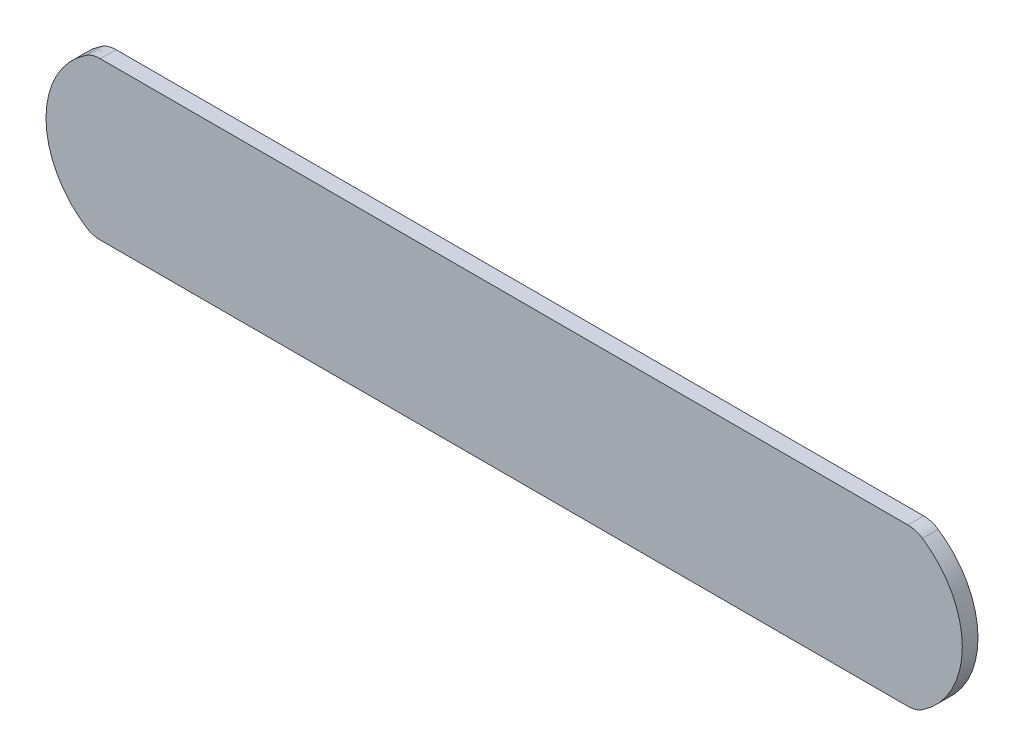
ISO-10303-21;
HEADER;
FILE_DESCRIPTION(('STEP AP214'),'2;1');
FILE_NAME('part.step','',(''),(''),'','','');
FILE_SCHEMA(('AUTOMOTIVE_DESIGN { 1 0 10303 214 1 1 1 1 }'));
ENDSEC;
DATA;
#1=APPLICATION_CONTEXT('core data for automotive mechanical design processes');
#2=APPLICATION_PROTOCOL_DEFINITION('international standard','automotive_design',2000,#1);
#3=PRODUCT_CONTEXT('',#1,'mechanical');
#4=PRODUCT('Part','Part','',(#3));
#5=PRODUCT_RELATED_PRODUCT_CATEGORY('part','',(#4));
#6=PRODUCT_DEFINITION_FORMATION('','',#4);
#7=PRODUCT_DEFINITION_CONTEXT('part definition',#1,'design');
#8=PRODUCT_DEFINITION('design','',#6,#7);
#9=PRODUCT_DEFINITION_SHAPE('','',#8);
#10=(LENGTH_UNIT() NAMED_UNIT(*) SI_UNIT(.MILLI.,.METRE.));
#11=(NAMED_UNIT(*) PLANE_ANGLE_UNIT() SI_UNIT($,.RADIAN.));
#12=(NAMED_UNIT(*) SI_UNIT($,.STERADIAN.) SOLID_ANGLE_UNIT());
#13=UNCERTAINTY_MEASURE_WITH_UNIT(LENGTH_MEASURE(1.E-05),#10,'distance_accuracy_value','');
#14=(GEOMETRIC_REPRESENTATION_CONTEXT(3) GLOBAL_UNCERTAINTY_ASSIGNED_CONTEXT((#13)) GLOBAL_UNIT_ASSIGNED_CONTEXT((#10,
#11,#12)) REPRESENTATION_CONTEXT('',''));
#15=CARTESIAN_POINT('',(0.,0.,0.));
#16=DIRECTION('',(0.,0.,1.));
#17=DIRECTION('',(1.,0.,0.));
#18=AXIS2_PLACEMENT_3D('',#15,#16,#17);
#19=CARTESIAN_POINT('',(79.896125242806,14.1673155686426,3.));
#20=CARTESIAN_POINT('',(79.2817768725564,14.5747670863004,3.));
#21=CARTESIAN_POINT('',(78.5764968857546,14.7873075620228,3.));
#22=CARTESIAN_POINT('',(77.870712637651,15.,3.));
#23=CARTESIAN_POINT('',(77.1340783595888,15.,3.));
#24=B_SPLINE_CURVE_WITH_KNOTS('',2,(#19,#20,#21,#22,#23),.UNSPECIFIED.,.F.,.F.,(3,2,3),(0.,0.5,
1.),.UNSPECIFIED.);
#25=DIRECTION('',(0.,0.,-1.));
#26=VECTOR('',#25,1.);
#27=SURFACE_OF_LINEAR_EXTRUSION('',#24,#26);
#28=CARTESIAN_POINT('',(79.896125242806,14.1673155686426,0.));
#29=CARTESIAN_POINT('',(79.2817768725564,14.5747670863004,0.));
#30=CARTESIAN_POINT('',(78.5764968857546,14.7873075620228,0.));
#31=CARTESIAN_POINT('',(77.870712637651,15.,0.));
#32=CARTESIAN_POINT('',(77.1340783595888,15.,0.));
#33=B_SPLINE_CURVE_WITH_KNOTS('',2,(#28,#29,#30,#31,#32),.UNSPECIFIED.,.F.,.F.,(3,2,3),(0.,0.5,
1.),.UNSPECIFIED.);
#34=CARTESIAN_POINT('',(79.896125242806,14.1673155686427,0.));
#35=VERTEX_POINT('',#34);
#36=CARTESIAN_POINT('',(77.1340783595888,15.,0.));
#37=VERTEX_POINT('',#36);
#38=EDGE_CURVE('E242',#35,#37,#33,.T.);
#39=ORIENTED_EDGE('',*,*,#38,.T.);
#40=DIRECTION('',(0.,0.,-1.));
#41=VECTOR('',#40,1.);
#42=CARTESIAN_POINT('',(77.1340783595888,15.,3.));
#43=LINE('',#42,#41);
#44=CARTESIAN_POINT('',(77.1340783595888,15.,3.));
#45=VERTEX_POINT('',#44);
#46=EDGE_CURVE('E11',#45,#37,#43,.T.);
#47=ORIENTED_EDGE('',*,*,#46,.F.);
#48=CARTESIAN_POINT('',(77.1340783595888,15.,3.));
#49=CARTESIAN_POINT('',(77.870712637651,15.,3.));
#50=CARTESIAN_POINT('',(78.5764968857546,14.7873075620228,3.));
#51=CARTESIAN_POINT('',(79.2817768725564,14.5747670863004,3.));
#52=CARTESIAN_POINT('',(79.896125242806,14.1673155686426,3.));
#53=B_SPLINE_CURVE_WITH_KNOTS('',2,(#48,#49,#50,#51,#52),.UNSPECIFIED.,.F.,.F.,(3,2,3),(0.,0.5,
1.),.UNSPECIFIED.);
#54=CARTESIAN_POINT('',(79.896125242806,14.1673155686427,3.));
#55=VERTEX_POINT('',#54);
#56=EDGE_CURVE('E247',#55,#45,#53,.F.);
#57=ORIENTED_EDGE('',*,*,#56,.F.);
#58=DIRECTION('',(0.,0.,-1.));
#59=VECTOR('',#58,1.);
#60=CARTESIAN_POINT('',(79.896125242806,14.1673155686427,3.));
#61=LINE('',#60,#59);
#62=EDGE_CURVE('E262',#55,#35,#61,.T.);
#63=ORIENTED_EDGE('',*,*,#62,.T.);
#64=EDGE_LOOP('',(#39,#47,#57,#63));
#65=FACE_BOUND('',#64,.T.);
#66=ADVANCED_FACE('F36',(#65),#27,.F.);
#67=CARTESIAN_POINT('',(77.1340783595888,15.,3.));
#68=DIRECTION('',(0.,-1.,0.));
#69=DIRECTION('',(0.,0.,-1.));
#70=AXIS2_PLACEMENT_3D('',#67,#68,#69);
#71=PLANE('',#70);
#72=DIRECTION('',(-1.,0.,0.));
#73=VECTOR('',#72,1.);
#74=CARTESIAN_POINT('',(77.1340783595888,15.,0.));
#75=LINE('',#74,#73);
#76=CARTESIAN_POINT('',(-77.1340783595889,15.,0.));
#77=VERTEX_POINT('',#76);
#78=EDGE_CURVE('E234',#37,#77,#75,.T.);
#79=ORIENTED_EDGE('',*,*,#78,.T.);
#80=DIRECTION('',(0.,0.,-1.));
#81=VECTOR('',#80,1.);
#82=CARTESIAN_POINT('',(-77.1340783595889,15.,3.));
#83=LINE('',#82,#81);
#84=CARTESIAN_POINT('',(-77.1340783595889,15.,3.));
#85=VERTEX_POINT('',#84);
#86=EDGE_CURVE('E49',#85,#77,#83,.T.);
#87=ORIENTED_EDGE('',*,*,#86,.F.);
#88=DIRECTION('',(-1.,0.,0.));
#89=VECTOR('',#88,1.);
#90=CARTESIAN_POINT('',(77.1340783595888,15.,3.));
#91=LINE('',#90,#89);
#92=EDGE_CURVE('E102',#45,#85,#91,.T.);
#93=ORIENTED_EDGE('',*,*,#92,.F.);
#94=ORIENTED_EDGE('',*,*,#46,.T.);
#95=EDGE_LOOP('',(#79,#87,#93,#94));
#96=FACE_BOUND('',#95,.T.);
#97=ADVANCED_FACE('F284',(#96),#71,.F.);
#98=CARTESIAN_POINT('',(-77.134078359589,15.,3.));
#99=CARTESIAN_POINT('',(-77.8712626376632,15.,3.));
#100=CARTESIAN_POINT('',(-78.576496817616,14.7873075825648,3.));
#101=CARTESIAN_POINT('',(-79.2822352268942,14.5744630940061,3.));
#102=CARTESIAN_POINT('',(-79.896125242806,14.1673155686427,3.));
#103=B_SPLINE_CURVE_WITH_KNOTS('',2,(#98,#99,#100,#101,#102),.UNSPECIFIED.,.F.,.F.,(3,2,3),(0.,
0.5,1.),.UNSPECIFIED.);
#104=DIRECTION('',(0.,0.,-1.));
#105=VECTOR('',#104,1.);
#106=SURFACE_OF_LINEAR_EXTRUSION('',#103,#105);
#107=CARTESIAN_POINT('',(-77.134078359589,15.,0.));
#108=CARTESIAN_POINT('',(-77.8712626376632,15.,0.));
#109=CARTESIAN_POINT('',(-78.576496817616,14.7873075825648,0.));
#110=CARTESIAN_POINT('',(-79.2822352268942,14.5744630940061,0.));
#111=CARTESIAN_POINT('',(-79.896125242806,14.1673155686427,0.));
#112=B_SPLINE_CURVE_WITH_KNOTS('',2,(#107,#108,#109,#110,#111),.UNSPECIFIED.,.F.,.F.,(3,2,3),
(0.,0.5,1.),.UNSPECIFIED.);
#113=CARTESIAN_POINT('',(-79.896125242806,14.1673155686427,0.));
#114=VERTEX_POINT('',#113);
#115=EDGE_CURVE('E241',#77,#114,#112,.T.);
#116=ORIENTED_EDGE('',*,*,#115,.T.);
#117=DIRECTION('',(0.,0.,-1.));
#118=VECTOR('',#117,1.);
#119=CARTESIAN_POINT('',(-79.896125242806,14.1673155686427,3.));
#120=LINE('',#119,#118);
#121=CARTESIAN_POINT('',(-79.896125242806,14.1673155686427,3.));
#122=VERTEX_POINT('',#121);
#123=EDGE_CURVE('E314',#122,#114,#120,.T.);
#124=ORIENTED_EDGE('',*,*,#123,.F.);
#125=CARTESIAN_POINT('',(-79.896125242806,14.1673155686427,3.));
#126=CARTESIAN_POINT('',(-79.2822352268942,14.5744630940061,3.));
#127=CARTESIAN_POINT('',(-78.576496817616,14.7873075825648,3.));
#128=CARTESIAN_POINT('',(-77.8712626376632,15.,3.));
#129=CARTESIAN_POINT('',(-77.134078359589,15.,3.));
#130=B_SPLINE_CURVE_WITH_KNOTS('',2,(#125,#126,#127,#128,#129),.UNSPECIFIED.,.F.,.F.,(3,2,3),
(0.,0.5,1.),.UNSPECIFIED.);
#131=EDGE_CURVE('E321',#85,#122,#130,.F.);
#132=ORIENTED_EDGE('',*,*,#131,.F.);
#133=ORIENTED_EDGE('',*,*,#86,.T.);
#134=EDGE_LOOP('',(#116,#124,#132,#133));
#135=FACE_BOUND('',#134,.T.);
#136=ADVANCED_FACE('F289',(#135),#106,.F.);
#137=CARTESIAN_POINT('',(-70.5,0.,3.));
#138=DIRECTION('',(0.,0.,-1.));
#139=DIRECTION('',(-1.,0.,0.));
#140=AXIS2_PLACEMENT_3D('',#137,#138,#139);
#141=CYLINDRICAL_SURFACE('',#140,17.0000000000001);
#142=CARTESIAN_POINT('',(-70.5,0.,0.));
#143=DIRECTION('',(0.,0.,1.));
#144=DIRECTION('',(1.,0.,0.));
#145=AXIS2_PLACEMENT_3D('',#142,#143,#144);
#146=CIRCLE('',#145,17.0000000000001);
#147=CARTESIAN_POINT('',(-79.896125242806,-14.1673155686427,0.));
#148=VERTEX_POINT('',#147);
#149=EDGE_CURVE('E208',#114,#148,#146,.T.);
#150=ORIENTED_EDGE('',*,*,#149,.T.);
#151=DIRECTION('',(0.,0.,-1.));
#152=VECTOR('',#151,1.);
#153=CARTESIAN_POINT('',(-79.896125242806,-14.1673155686427,3.));
#154=LINE('',#153,#152);
#155=CARTESIAN_POINT('',(-79.896125242806,-14.1673155686427,3.));
#156=VERTEX_POINT('',#155);
#157=EDGE_CURVE('E316',#156,#148,#154,.T.);
#158=ORIENTED_EDGE('',*,*,#157,.F.);
#159=CARTESIAN_POINT('',(-70.5,0.,3.));
#160=DIRECTION('',(0.,0.,1.));
#161=DIRECTION('',(1.,0.,0.));
#162=AXIS2_PLACEMENT_3D('',#159,#160,#161);
#163=CIRCLE('',#162,17.0000000000001);
#164=EDGE_CURVE('E322',#122,#156,#163,.T.);
#165=ORIENTED_EDGE('',*,*,#164,.F.);
#166=ORIENTED_EDGE('',*,*,#123,.T.);
#167=EDGE_LOOP('',(#150,#158,#165,#166));
#168=FACE_BOUND('',#167,.T.);
#169=ADVANCED_FACE('F180',(#168),#141,.T.);
#170=CARTESIAN_POINT('',(-79.896125242806,-14.1673155686427,3.));
#171=CARTESIAN_POINT('',(-79.28177687255,-14.5747670863046,3.));
#172=CARTESIAN_POINT('',(-78.5764968857546,-14.7873075620229,3.));
#173=CARTESIAN_POINT('',(-77.8707126376432,-15.,3.));
#174=CARTESIAN_POINT('',(-77.134078359589,-15.,3.));
#175=B_SPLINE_CURVE_WITH_KNOTS('',2,(#170,#171,#172,#173,#174),.UNSPECIFIED.,.F.,.F.,(3,2,3),
(0.,0.5,1.),.UNSPECIFIED.);
#176=DIRECTION('',(0.,0.,-1.));
#177=VECTOR('',#176,1.);
#178=SURFACE_OF_LINEAR_EXTRUSION('',#175,#177);
#179=CARTESIAN_POINT('',(-79.896125242806,-14.1673155686427,0.));
#180=CARTESIAN_POINT('',(-79.28177687255,-14.5747670863046,0.));
#181=CARTESIAN_POINT('',(-78.5764968857546,-14.7873075620229,0.));
#182=CARTESIAN_POINT('',(-77.8707126376432,-15.,0.));
#183=CARTESIAN_POINT('',(-77.134078359589,-15.,0.));
#184=B_SPLINE_CURVE_WITH_KNOTS('',2,(#179,#180,#181,#182,#183),.UNSPECIFIED.,.F.,.F.,(3,2,3),
(0.,0.5,1.),.UNSPECIFIED.);
#185=CARTESIAN_POINT('',(-77.134078359589,-15.,0.));
#186=VERTEX_POINT('',#185);
#187=EDGE_CURVE('E204',#148,#186,#184,.T.);
#188=ORIENTED_EDGE('',*,*,#187,.T.);
#189=DIRECTION('',(0.,0.,-1.));
#190=VECTOR('',#189,1.);
#191=CARTESIAN_POINT('',(-77.134078359589,-15.,3.));
#192=LINE('',#191,#190);
#193=CARTESIAN_POINT('',(-77.134078359589,-15.,3.));
#194=VERTEX_POINT('',#193);
#195=EDGE_CURVE('E132',#194,#186,#192,.T.);
#196=ORIENTED_EDGE('',*,*,#195,.F.);
#197=CARTESIAN_POINT('',(-77.134078359589,-15.,3.));
#198=CARTESIAN_POINT('',(-77.8707126376432,-15.,3.));
#199=CARTESIAN_POINT('',(-78.5764968857546,-14.7873075620229,3.));
#200=CARTESIAN_POINT('',(-79.28177687255,-14.5747670863046,3.));
#201=CARTESIAN_POINT('',(-79.896125242806,-14.1673155686427,3.));
#202=B_SPLINE_CURVE_WITH_KNOTS('',2,(#197,#198,#199,#200,#201),.UNSPECIFIED.,.F.,.F.,(3,2,3),
(0.,0.5,1.),.UNSPECIFIED.);
#203=EDGE_CURVE('E122',#156,#194,#202,.F.);
#204=ORIENTED_EDGE('',*,*,#203,.F.);
#205=ORIENTED_EDGE('',*,*,#157,.T.);
#206=EDGE_LOOP('',(#188,#196,#204,#205));
#207=FACE_BOUND('',#206,.T.);
#208=ADVANCED_FACE('F176',(#207),#178,.F.);
#209=CARTESIAN_POINT('',(-77.134078359589,-15.,3.));
#210=DIRECTION('',(0.,1.,0.));
#211=DIRECTION('',(-1.,0.,0.));
#212=AXIS2_PLACEMENT_3D('',#209,#210,#211);
#213=PLANE('',#212);
#214=DIRECTION('',(1.,0.,0.));
#215=VECTOR('',#214,1.);
#216=CARTESIAN_POINT('',(-77.134078359589,-15.,0.));
#217=LINE('',#216,#215);
#218=CARTESIAN_POINT('',(77.1340783595889,-15.,0.));
#219=VERTEX_POINT('',#218);
#220=EDGE_CURVE('E131',#186,#219,#217,.T.);
#221=ORIENTED_EDGE('',*,*,#220,.T.);
#222=DIRECTION('',(0.,0.,-1.));
#223=VECTOR('',#222,1.);
#224=CARTESIAN_POINT('',(77.1340783595889,-15.,3.));
#225=LINE('',#224,#223);
#226=CARTESIAN_POINT('',(77.1340783595889,-15.,3.));
#227=VERTEX_POINT('',#226);
#228=EDGE_CURVE('E128',#227,#219,#225,.T.);
#229=ORIENTED_EDGE('',*,*,#228,.F.);
#230=DIRECTION('',(1.,0.,0.));
#231=VECTOR('',#230,1.);
#232=CARTESIAN_POINT('',(-77.134078359589,-15.,3.));
#233=LINE('',#232,#231);
#234=EDGE_CURVE('E115',#194,#227,#233,.T.);
#235=ORIENTED_EDGE('',*,*,#234,.F.);
#236=ORIENTED_EDGE('',*,*,#195,.T.);
#237=EDGE_LOOP('',(#221,#229,#235,#236));
#238=FACE_BOUND('',#237,.T.);
#239=ADVANCED_FACE('F129',(#238),#213,.F.);
#240=CARTESIAN_POINT('',(77.1340783595889,-15.,3.));
#241=CARTESIAN_POINT('',(77.8712626376446,-15.,3.));
#242=CARTESIAN_POINT('',(78.5764968176161,-14.7873075825648,3.));
#243=CARTESIAN_POINT('',(79.2822352268788,-14.5744630940163,3.));
#244=CARTESIAN_POINT('',(79.8961252428061,-14.1673155686426,3.));
#245=B_SPLINE_CURVE_WITH_KNOTS('',2,(#240,#241,#242,#243,#244),.UNSPECIFIED.,.F.,.F.,(3,2,3),
(0.,0.5,1.),.UNSPECIFIED.);
#246=DIRECTION('',(0.,0.,-1.));
#247=VECTOR('',#246,1.);
#248=SURFACE_OF_LINEAR_EXTRUSION('',#245,#247);
#249=CARTESIAN_POINT('',(77.1340783595889,-15.,0.));
#250=CARTESIAN_POINT('',(77.8712626376446,-15.,0.));
#251=CARTESIAN_POINT('',(78.5764968176161,-14.7873075825648,0.));
#252=CARTESIAN_POINT('',(79.2822352268788,-14.5744630940163,0.));
#253=CARTESIAN_POINT('',(79.8961252428061,-14.1673155686426,0.));
#254=B_SPLINE_CURVE_WITH_KNOTS('',2,(#249,#250,#251,#252,#253),.UNSPECIFIED.,.F.,.F.,(3,2,3),
(0.,0.5,1.),.UNSPECIFIED.);
#255=CARTESIAN_POINT('',(79.8961252428061,-14.1673155686426,0.));
#256=VERTEX_POINT('',#255);
#257=EDGE_CURVE('E87',#219,#256,#254,.T.);
#258=ORIENTED_EDGE('',*,*,#257,.T.);
#259=DIRECTION('',(0.,0.,-1.));
#260=VECTOR('',#259,1.);
#261=CARTESIAN_POINT('',(79.8961252428061,-14.1673155686426,3.));
#262=LINE('',#261,#260);
#263=CARTESIAN_POINT('',(79.8961252428061,-14.1673155686426,3.));
#264=VERTEX_POINT('',#263);
#265=EDGE_CURVE('E133',#264,#256,#262,.T.);
#266=ORIENTED_EDGE('',*,*,#265,.F.);
#267=CARTESIAN_POINT('',(79.8961252428061,-14.1673155686426,3.));
#268=CARTESIAN_POINT('',(79.2822352268788,-14.5744630940163,3.));
#269=CARTESIAN_POINT('',(78.5764968176161,-14.7873075825648,3.));
#270=CARTESIAN_POINT('',(77.8712626376446,-15.,3.));
#271=CARTESIAN_POINT('',(77.1340783595889,-15.,3.));
#272=B_SPLINE_CURVE_WITH_KNOTS('',2,(#267,#268,#269,#270,#271),.UNSPECIFIED.,.F.,.F.,(3,2,3),
(0.,0.5,1.),.UNSPECIFIED.);
#273=EDGE_CURVE('E119',#227,#264,#272,.F.);
#274=ORIENTED_EDGE('',*,*,#273,.F.);
#275=ORIENTED_EDGE('',*,*,#228,.T.);
#276=EDGE_LOOP('',(#258,#266,#274,#275));
#277=FACE_BOUND('',#276,.T.);
#278=ADVANCED_FACE('F136',(#277),#248,.F.);
#279=CARTESIAN_POINT('',(70.5,0.,3.));
#280=DIRECTION('',(0.,0.,-1.));
#281=DIRECTION('',(-1.,0.,0.));
#282=AXIS2_PLACEMENT_3D('',#279,#280,#281);
#283=CYLINDRICAL_SURFACE('',#282,17.);
#284=CARTESIAN_POINT('',(70.5,0.,0.));
#285=DIRECTION('',(0.,0.,1.));
#286=DIRECTION('',(1.,0.,0.));
#287=AXIS2_PLACEMENT_3D('',#284,#285,#286);
#288=CIRCLE('',#287,17.);
#289=EDGE_CURVE('E94',#256,#35,#288,.T.);
#290=ORIENTED_EDGE('',*,*,#289,.T.);
#291=ORIENTED_EDGE('',*,*,#62,.F.);
#292=CARTESIAN_POINT('',(70.5,0.,3.));
#293=DIRECTION('',(0.,0.,1.));
#294=DIRECTION('',(1.,0.,0.));
#295=AXIS2_PLACEMENT_3D('',#292,#293,#294);
#296=CIRCLE('',#295,17.);
#297=EDGE_CURVE('E58',#264,#55,#296,.T.);
#298=ORIENTED_EDGE('',*,*,#297,.F.);
#299=ORIENTED_EDGE('',*,*,#265,.T.);
#300=EDGE_LOOP('',(#290,#291,#298,#299));
#301=FACE_BOUND('',#300,.T.);
#302=ADVANCED_FACE('F156',(#301),#283,.T.);
#303=CARTESIAN_POINT('',(78.5764968857546,14.7873075620228,3.));
#304=DIRECTION('',(0.,0.,-1.));
#305=DIRECTION('',(-1.,0.,0.));
#306=AXIS2_PLACEMENT_3D('',#303,#304,#305);
#307=PLANE('',#306);
#308=ORIENTED_EDGE('',*,*,#56,.T.);
#309=ORIENTED_EDGE('',*,*,#92,.T.);
#310=ORIENTED_EDGE('',*,*,#131,.T.);
#311=ORIENTED_EDGE('',*,*,#164,.T.);
#312=ORIENTED_EDGE('',*,*,#203,.T.);
#313=ORIENTED_EDGE('',*,*,#234,.T.);
#314=ORIENTED_EDGE('',*,*,#273,.T.);
#315=ORIENTED_EDGE('',*,*,#297,.T.);
#316=EDGE_LOOP('',(#308,#309,#310,#311,#312,#313,#314,#315));
#317=FACE_BOUND('',#316,.T.);
#318=ADVANCED_FACE('F117',(#317),#307,.F.);
#319=CARTESIAN_POINT('',(78.5764968857546,14.7873075620228,0.));
#320=DIRECTION('',(0.,0.,-1.));
#321=DIRECTION('',(-1.,0.,0.));
#322=AXIS2_PLACEMENT_3D('',#319,#320,#321);
#323=PLANE('',#322);
#324=ORIENTED_EDGE('',*,*,#38,.F.);
#325=ORIENTED_EDGE('',*,*,#289,.F.);
#326=ORIENTED_EDGE('',*,*,#257,.F.);
#327=ORIENTED_EDGE('',*,*,#220,.F.);
#328=ORIENTED_EDGE('',*,*,#187,.F.);
#329=ORIENTED_EDGE('',*,*,#149,.F.);
#330=ORIENTED_EDGE('',*,*,#115,.F.);
#331=ORIENTED_EDGE('',*,*,#78,.F.);
#332=EDGE_LOOP('',(#324,#325,#326,#327,#328,#329,#330,#331));
#333=FACE_BOUND('',#332,.T.);
#334=ADVANCED_FACE('F210',(#333),#323,.T.);
#335=CLOSED_SHELL('',(#66,#97,#136,#169,#208,#239,#278,#302,#318,#334));
#336=MANIFOLD_SOLID_BREP('B2',#335);
#337=ADVANCED_BREP_SHAPE_REPRESENTATION('',(#18,#336),#14);
#338=SHAPE_DEFINITION_REPRESENTATION(#9,#337);
ENDSEC;
END-ISO-10303-21;
